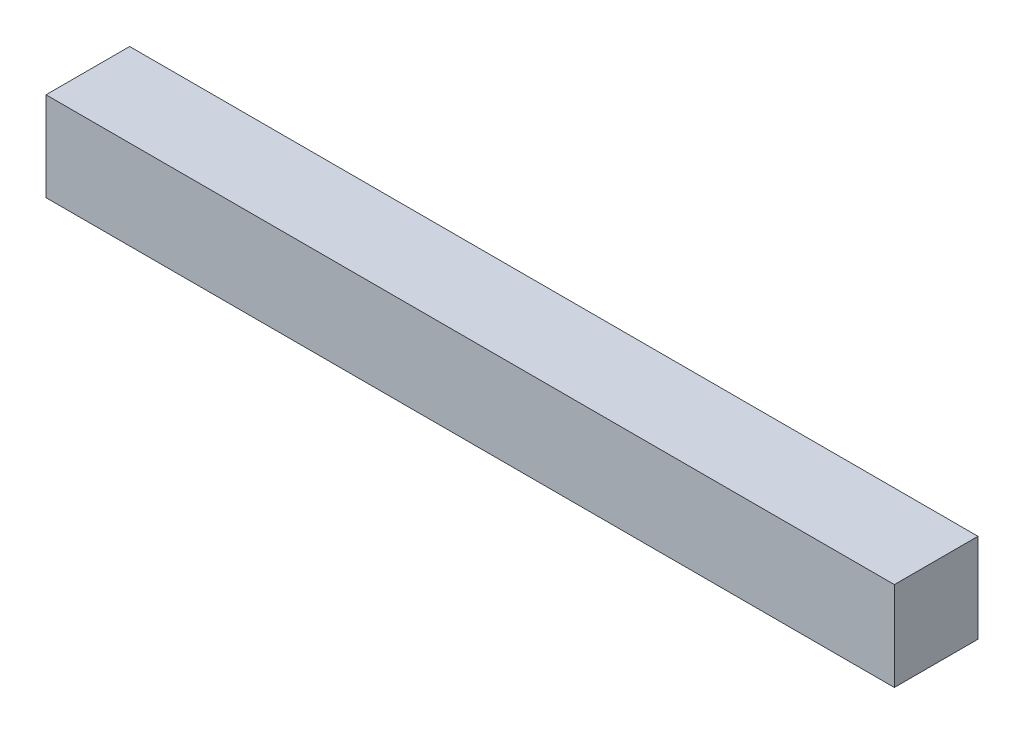
ISO-10303-21;
HEADER;
FILE_DESCRIPTION(('STEP AP214'),'2;1');
FILE_NAME('part.step','',(''),(''),'','','');
FILE_SCHEMA(('AUTOMOTIVE_DESIGN { 1 0 10303 214 1 1 1 1 }'));
ENDSEC;
DATA;
#1=APPLICATION_CONTEXT('core data for automotive mechanical design processes');
#2=APPLICATION_PROTOCOL_DEFINITION('international standard','automotive_design',2000,#1);
#3=PRODUCT_CONTEXT('',#1,'mechanical');
#4=PRODUCT('Part','Part','',(#3));
#5=PRODUCT_RELATED_PRODUCT_CATEGORY('part','',(#4));
#6=PRODUCT_DEFINITION_FORMATION('','',#4);
#7=PRODUCT_DEFINITION_CONTEXT('part definition',#1,'design');
#8=PRODUCT_DEFINITION('design','',#6,#7);
#9=PRODUCT_DEFINITION_SHAPE('','',#8);
#10=(LENGTH_UNIT() NAMED_UNIT(*) SI_UNIT(.MILLI.,.METRE.));
#11=(NAMED_UNIT(*) PLANE_ANGLE_UNIT() SI_UNIT($,.RADIAN.));
#12=(NAMED_UNIT(*) SI_UNIT($,.STERADIAN.) SOLID_ANGLE_UNIT());
#13=UNCERTAINTY_MEASURE_WITH_UNIT(LENGTH_MEASURE(1.E-05),#10,'distance_accuracy_value','');
#14=(GEOMETRIC_REPRESENTATION_CONTEXT(3) GLOBAL_UNCERTAINTY_ASSIGNED_CONTEXT((#13)) GLOBAL_UNIT_ASSIGNED_CONTEXT((#10,
#11,#12)) REPRESENTATION_CONTEXT('',''));
#15=CARTESIAN_POINT('',(0.,0.,0.));
#16=DIRECTION('',(0.,0.,1.));
#17=DIRECTION('',(1.,0.,0.));
#18=AXIS2_PLACEMENT_3D('',#15,#16,#17);
#19=CARTESIAN_POINT('',(25.36,5.33,-2.5));
#20=DIRECTION('',(-1.,0.,0.));
#21=DIRECTION('',(0.,0.,1.));
#22=AXIS2_PLACEMENT_3D('',#19,#20,#21);
#23=PLANE('',#22);
#24=DIRECTION('',(0.,0.,-1.));
#25=VECTOR('',#24,1.);
#26=CARTESIAN_POINT('',(25.36,0.,-2.5));
#27=LINE('',#26,#25);
#28=CARTESIAN_POINT('',(25.36,0.,2.5));
#29=VERTEX_POINT('',#28);
#30=CARTESIAN_POINT('',(25.36,0.,-2.5));
#31=VERTEX_POINT('',#30);
#32=EDGE_CURVE('E105',#29,#31,#27,.T.);
#33=ORIENTED_EDGE('',*,*,#32,.T.);
#34=DIRECTION('',(0.,-1.,0.));
#35=VECTOR('',#34,1.);
#36=CARTESIAN_POINT('',(25.36,5.33,-2.5));
#37=LINE('',#36,#35);
#38=CARTESIAN_POINT('',(25.36,5.33,-2.5));
#39=VERTEX_POINT('',#38);
#40=EDGE_CURVE('E11',#39,#31,#37,.T.);
#41=ORIENTED_EDGE('',*,*,#40,.F.);
#42=DIRECTION('',(0.,0.,-1.));
#43=VECTOR('',#42,1.);
#44=CARTESIAN_POINT('',(25.36,5.33,-2.5));
#45=LINE('',#44,#43);
#46=CARTESIAN_POINT('',(25.36,5.33,2.5));
#47=VERTEX_POINT('',#46);
#48=EDGE_CURVE('E89',#47,#39,#45,.T.);
#49=ORIENTED_EDGE('',*,*,#48,.F.);
#50=DIRECTION('',(0.,-1.,0.));
#51=VECTOR('',#50,1.);
#52=CARTESIAN_POINT('',(25.36,5.33,2.5));
#53=LINE('',#52,#51);
#54=EDGE_CURVE('E97',#47,#29,#53,.T.);
#55=ORIENTED_EDGE('',*,*,#54,.T.);
#56=EDGE_LOOP('',(#33,#41,#49,#55));
#57=FACE_BOUND('',#56,.T.);
#58=ADVANCED_FACE('F39',(#57),#23,.F.);
#59=CARTESIAN_POINT('',(-25.36,5.33,-2.5));
#60=DIRECTION('',(0.,0.,1.));
#61=DIRECTION('',(1.,0.,0.));
#62=AXIS2_PLACEMENT_3D('',#59,#60,#61);
#63=PLANE('',#62);
#64=DIRECTION('',(-1.,0.,0.));
#65=VECTOR('',#64,1.);
#66=CARTESIAN_POINT('',(-25.36,0.,-2.5));
#67=LINE('',#66,#65);
#68=CARTESIAN_POINT('',(-25.36,0.,-2.5));
#69=VERTEX_POINT('',#68);
#70=EDGE_CURVE('E92',#31,#69,#67,.T.);
#71=ORIENTED_EDGE('',*,*,#70,.T.);
#72=DIRECTION('',(0.,-1.,0.));
#73=VECTOR('',#72,1.);
#74=CARTESIAN_POINT('',(-25.36,5.33,-2.5));
#75=LINE('',#74,#73);
#76=CARTESIAN_POINT('',(-25.36,5.33,-2.5));
#77=VERTEX_POINT('',#76);
#78=EDGE_CURVE('E50',#77,#69,#75,.T.);
#79=ORIENTED_EDGE('',*,*,#78,.F.);
#80=DIRECTION('',(-1.,0.,0.));
#81=VECTOR('',#80,1.);
#82=CARTESIAN_POINT('',(-25.36,5.33,-2.5));
#83=LINE('',#82,#81);
#84=EDGE_CURVE('E82',#39,#77,#83,.T.);
#85=ORIENTED_EDGE('',*,*,#84,.F.);
#86=ORIENTED_EDGE('',*,*,#40,.T.);
#87=EDGE_LOOP('',(#71,#79,#85,#86));
#88=FACE_BOUND('',#87,.T.);
#89=ADVANCED_FACE('F93',(#88),#63,.F.);
#90=CARTESIAN_POINT('',(-25.36,5.33,-2.5));
#91=DIRECTION('',(1.,0.,0.));
#92=DIRECTION('',(0.,0.,-1.));
#93=AXIS2_PLACEMENT_3D('',#90,#91,#92);
#94=PLANE('',#93);
#95=DIRECTION('',(0.,0.,1.));
#96=VECTOR('',#95,1.);
#97=CARTESIAN_POINT('',(-25.36,0.,-2.5));
#98=LINE('',#97,#96);
#99=CARTESIAN_POINT('',(-25.36,0.,2.5));
#100=VERTEX_POINT('',#99);
#101=EDGE_CURVE('E75',#69,#100,#98,.T.);
#102=ORIENTED_EDGE('',*,*,#101,.T.);
#103=DIRECTION('',(0.,-1.,0.));
#104=VECTOR('',#103,1.);
#105=CARTESIAN_POINT('',(-25.36,5.33,2.5));
#106=LINE('',#105,#104);
#107=CARTESIAN_POINT('',(-25.36,5.33,2.5));
#108=VERTEX_POINT('',#107);
#109=EDGE_CURVE('E94',#108,#100,#106,.T.);
#110=ORIENTED_EDGE('',*,*,#109,.F.);
#111=DIRECTION('',(0.,0.,1.));
#112=VECTOR('',#111,1.);
#113=CARTESIAN_POINT('',(-25.36,5.33,-2.5));
#114=LINE('',#113,#112);
#115=EDGE_CURVE('E88',#77,#108,#114,.T.);
#116=ORIENTED_EDGE('',*,*,#115,.F.);
#117=ORIENTED_EDGE('',*,*,#78,.T.);
#118=EDGE_LOOP('',(#102,#110,#116,#117));
#119=FACE_BOUND('',#118,.T.);
#120=ADVANCED_FACE('F96',(#119),#94,.F.);
#121=CARTESIAN_POINT('',(-25.36,5.33,2.5));
#122=DIRECTION('',(0.,0.,-1.));
#123=DIRECTION('',(-1.,0.,0.));
#124=AXIS2_PLACEMENT_3D('',#121,#122,#123);
#125=PLANE('',#124);
#126=DIRECTION('',(1.,0.,0.));
#127=VECTOR('',#126,1.);
#128=CARTESIAN_POINT('',(-25.36,0.,2.5));
#129=LINE('',#128,#127);
#130=EDGE_CURVE('E76',#100,#29,#129,.T.);
#131=ORIENTED_EDGE('',*,*,#130,.T.);
#132=ORIENTED_EDGE('',*,*,#54,.F.);
#133=DIRECTION('',(1.,0.,0.));
#134=VECTOR('',#133,1.);
#135=CARTESIAN_POINT('',(-25.36,5.33,2.5));
#136=LINE('',#135,#134);
#137=EDGE_CURVE('E54',#108,#47,#136,.T.);
#138=ORIENTED_EDGE('',*,*,#137,.F.);
#139=ORIENTED_EDGE('',*,*,#109,.T.);
#140=EDGE_LOOP('',(#131,#132,#138,#139));
#141=FACE_BOUND('',#140,.T.);
#142=ADVANCED_FACE('F109',(#141),#125,.F.);
#143=CARTESIAN_POINT('',(0.,5.33,0.));
#144=DIRECTION('',(0.,1.,0.));
#145=DIRECTION('',(0.,0.,1.));
#146=AXIS2_PLACEMENT_3D('',#143,#144,#145);
#147=PLANE('',#146);
#148=ORIENTED_EDGE('',*,*,#48,.T.);
#149=ORIENTED_EDGE('',*,*,#84,.T.);
#150=ORIENTED_EDGE('',*,*,#115,.T.);
#151=ORIENTED_EDGE('',*,*,#137,.T.);
#152=EDGE_LOOP('',(#148,#149,#150,#151));
#153=FACE_BOUND('',#152,.T.);
#154=ADVANCED_FACE('F86',(#153),#147,.T.);
#155=CARTESIAN_POINT('',(0.,0.,0.));
#156=DIRECTION('',(0.,1.,0.));
#157=DIRECTION('',(0.,0.,1.));
#158=AXIS2_PLACEMENT_3D('',#155,#156,#157);
#159=PLANE('',#158);
#160=ORIENTED_EDGE('',*,*,#32,.F.);
#161=ORIENTED_EDGE('',*,*,#130,.F.);
#162=ORIENTED_EDGE('',*,*,#101,.F.);
#163=ORIENTED_EDGE('',*,*,#70,.F.);
#164=EDGE_LOOP('',(#160,#161,#162,#163));
#165=FACE_BOUND('',#164,.T.);
#166=ADVANCED_FACE('F115',(#165),#159,.F.);
#167=CLOSED_SHELL('',(#58,#89,#120,#142,#154,#166));
#168=MANIFOLD_SOLID_BREP('B2',#167);
#169=ADVANCED_BREP_SHAPE_REPRESENTATION('',(#18,#168),#14);
#170=SHAPE_DEFINITION_REPRESENTATION(#9,#169);
ENDSEC;
END-ISO-10303-21;
